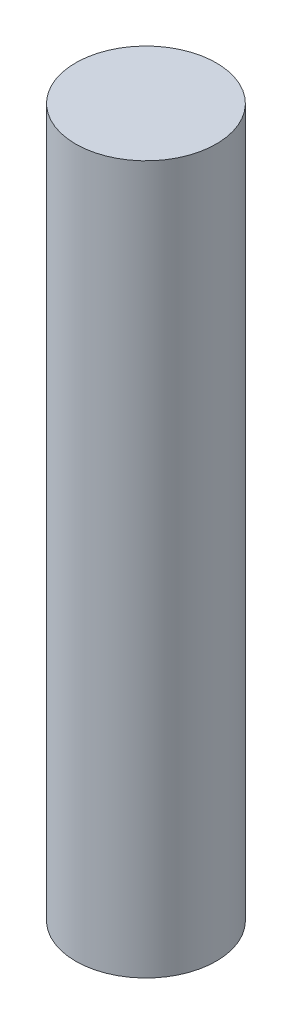
ISO-10303-21;
HEADER;
FILE_DESCRIPTION(('STEP AP214'),'2;1');
FILE_NAME('part.step','',(''),(''),'','','');
FILE_SCHEMA(('AUTOMOTIVE_DESIGN { 1 0 10303 214 1 1 1 1 }'));
ENDSEC;
DATA;
#1=APPLICATION_CONTEXT('core data for automotive mechanical design processes');
#2=APPLICATION_PROTOCOL_DEFINITION('international standard','automotive_design',2000,#1);
#3=PRODUCT_CONTEXT('',#1,'mechanical');
#4=PRODUCT('Part','Part','',(#3));
#5=PRODUCT_RELATED_PRODUCT_CATEGORY('part','',(#4));
#6=PRODUCT_DEFINITION_FORMATION('','',#4);
#7=PRODUCT_DEFINITION_CONTEXT('part definition',#1,'design');
#8=PRODUCT_DEFINITION('design','',#6,#7);
#9=PRODUCT_DEFINITION_SHAPE('','',#8);
#10=(LENGTH_UNIT() NAMED_UNIT(*) SI_UNIT(.MILLI.,.METRE.));
#11=(NAMED_UNIT(*) PLANE_ANGLE_UNIT() SI_UNIT($,.RADIAN.));
#12=(NAMED_UNIT(*) SI_UNIT($,.STERADIAN.) SOLID_ANGLE_UNIT());
#13=UNCERTAINTY_MEASURE_WITH_UNIT(LENGTH_MEASURE(1.E-05),#10,'distance_accuracy_value','');
#14=(GEOMETRIC_REPRESENTATION_CONTEXT(3) GLOBAL_UNCERTAINTY_ASSIGNED_CONTEXT((#13)) GLOBAL_UNIT_ASSIGNED_CONTEXT((#10,
#11,#12)) REPRESENTATION_CONTEXT('',''));
#15=CARTESIAN_POINT('',(0.,0.,0.));
#16=DIRECTION('',(0.,0.,1.));
#17=DIRECTION('',(1.,0.,0.));
#18=AXIS2_PLACEMENT_3D('',#15,#16,#17);
#19=CARTESIAN_POINT('',(0.,8.,0.));
#20=DIRECTION('',(0.,-1.,0.));
#21=DIRECTION('',(0.,0.,-1.));
#22=AXIS2_PLACEMENT_3D('',#19,#20,#21);
#23=CYLINDRICAL_SURFACE('',#22,0.795);
#24=CARTESIAN_POINT('',(0.,8.,0.));
#25=DIRECTION('',(0.,1.,0.));
#26=DIRECTION('',(0.,0.,1.));
#27=AXIS2_PLACEMENT_3D('',#24,#25,#26);
#28=CIRCLE('',#27,0.795);
#29=CARTESIAN_POINT('',(0.,8.,0.795));
#30=VERTEX_POINT('',#29);
#31=EDGE_CURVE('E10',#30,#30,#28,.T.);
#32=ORIENTED_EDGE('',*,*,#31,.F.);
#33=EDGE_LOOP('',(#32));
#34=FACE_BOUND('',#33,.T.);
#35=CARTESIAN_POINT('',(0.,0.,0.));
#36=DIRECTION('',(0.,1.,0.));
#37=DIRECTION('',(0.,0.,1.));
#38=AXIS2_PLACEMENT_3D('',#35,#36,#37);
#39=CIRCLE('',#38,0.795);
#40=CARTESIAN_POINT('',(0.,0.,0.795));
#41=VERTEX_POINT('',#40);
#42=EDGE_CURVE('E35',#41,#41,#39,.T.);
#43=ORIENTED_EDGE('',*,*,#42,.T.);
#44=EDGE_LOOP('',(#43));
#45=FACE_BOUND('',#44,.T.);
#46=ADVANCED_FACE('F32',(#34,#45),#23,.T.);
#47=CARTESIAN_POINT('',(0.,8.,0.));
#48=DIRECTION('',(0.,1.,0.));
#49=DIRECTION('',(0.,0.,1.));
#50=AXIS2_PLACEMENT_3D('',#47,#48,#49);
#51=PLANE('',#50);
#52=ORIENTED_EDGE('',*,*,#31,.T.);
#53=EDGE_LOOP('',(#52));
#54=FACE_BOUND('',#53,.T.);
#55=ADVANCED_FACE('F47',(#54),#51,.T.);
#56=CARTESIAN_POINT('',(0.,0.,0.));
#57=DIRECTION('',(0.,1.,0.));
#58=DIRECTION('',(0.,0.,1.));
#59=AXIS2_PLACEMENT_3D('',#56,#57,#58);
#60=PLANE('',#59);
#61=ORIENTED_EDGE('',*,*,#42,.F.);
#62=EDGE_LOOP('',(#61));
#63=FACE_BOUND('',#62,.T.);
#64=ADVANCED_FACE('F45',(#63),#60,.F.);
#65=CLOSED_SHELL('',(#46,#55,#64));
#66=MANIFOLD_SOLID_BREP('B2',#65);
#67=ADVANCED_BREP_SHAPE_REPRESENTATION('',(#18,#66),#14);
#68=SHAPE_DEFINITION_REPRESENTATION(#9,#67);
ENDSEC;
END-ISO-10303-21;
